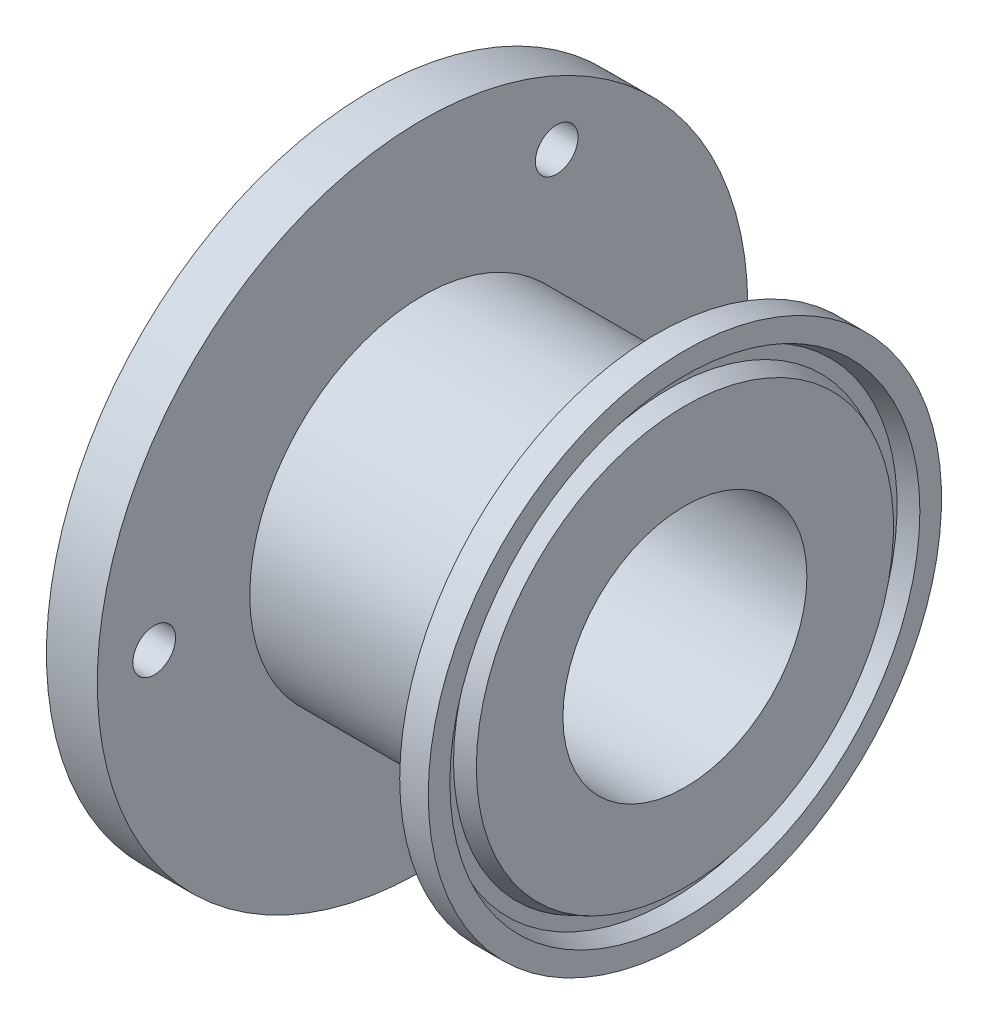
ISO-10303-21;
HEADER;
FILE_DESCRIPTION(('STEP AP214'),'2;1');
FILE_NAME('part.step','',(''),(''),'','','');
FILE_SCHEMA(('AUTOMOTIVE_DESIGN { 1 0 10303 214 1 1 1 1 }'));
ENDSEC;
DATA;
#1=APPLICATION_CONTEXT('core data for automotive mechanical design processes');
#2=APPLICATION_PROTOCOL_DEFINITION('international standard','automotive_design',2000,#1);
#3=PRODUCT_CONTEXT('',#1,'mechanical');
#4=PRODUCT('Part','Part','',(#3));
#5=PRODUCT_RELATED_PRODUCT_CATEGORY('part','',(#4));
#6=PRODUCT_DEFINITION_FORMATION('','',#4);
#7=PRODUCT_DEFINITION_CONTEXT('part definition',#1,'design');
#8=PRODUCT_DEFINITION('design','',#6,#7);
#9=PRODUCT_DEFINITION_SHAPE('','',#8);
#10=(LENGTH_UNIT() NAMED_UNIT(*) SI_UNIT(.MILLI.,.METRE.));
#11=(NAMED_UNIT(*) PLANE_ANGLE_UNIT() SI_UNIT($,.RADIAN.));
#12=(NAMED_UNIT(*) SI_UNIT($,.STERADIAN.) SOLID_ANGLE_UNIT());
#13=UNCERTAINTY_MEASURE_WITH_UNIT(LENGTH_MEASURE(1.E-05),#10,'distance_accuracy_value','');
#14=(GEOMETRIC_REPRESENTATION_CONTEXT(3) GLOBAL_UNCERTAINTY_ASSIGNED_CONTEXT((#13)) GLOBAL_UNIT_ASSIGNED_CONTEXT((#10,
#11,#12)) REPRESENTATION_CONTEXT('',''));
#15=CARTESIAN_POINT('',(0.,0.,0.));
#16=DIRECTION('',(0.,0.,1.));
#17=DIRECTION('',(1.,0.,0.));
#18=AXIS2_PLACEMENT_3D('',#15,#16,#17);
#19=CARTESIAN_POINT('',(-10.4047272163481,34.,0.));
#20=DIRECTION('',(-1.,0.,0.));
#21=DIRECTION('',(0.,0.,1.));
#22=AXIS2_PLACEMENT_3D('',#19,#20,#21);
#23=PLANE('',#22);
#24=CARTESIAN_POINT('',(-10.4047272163481,0.,0.));
#25=DIRECTION('',(-1.,0.,0.));
#26=DIRECTION('',(0.,0.,1.));
#27=AXIS2_PLACEMENT_3D('',#24,#25,#26);
#28=CIRCLE('',#27,17.);
#29=CARTESIAN_POINT('',(-10.4047272163481,0.,17.));
#30=VERTEX_POINT('',#29);
#31=EDGE_CURVE('E81',#30,#30,#28,.T.);
#32=ORIENTED_EDGE('',*,*,#31,.T.);
#33=EDGE_LOOP('',(#32));
#34=FACE_BOUND('',#33,.T.);
#35=CARTESIAN_POINT('',(-10.4047272163481,1.08713038571295E-09,26.4000000000021));
#36=DIRECTION('',(-1.,0.,0.));
#37=DIRECTION('',(0.,0.,1.));
#38=AXIS2_PLACEMENT_3D('',#35,#36,#37);
#39=CIRCLE('',#38,2.1);
#40=CARTESIAN_POINT('',(-10.4047272163481,1.08713038571295E-09,28.5000000000021));
#41=VERTEX_POINT('',#40);
#42=EDGE_CURVE('E87',#41,#41,#39,.T.);
#43=ORIENTED_EDGE('',*,*,#42,.T.);
#44=EDGE_LOOP('',(#43));
#45=FACE_BOUND('',#44,.T.);
#46=CARTESIAN_POINT('',(-10.4047272163481,22.8630706593604,-13.2000000009425));
#47=DIRECTION('',(-1.,0.,0.));
#48=DIRECTION('',(0.,0.,1.));
#49=AXIS2_PLACEMENT_3D('',#46,#47,#48);
#50=CIRCLE('',#49,2.1);
#51=CARTESIAN_POINT('',(-10.4047272163481,22.8630706593604,-11.1000000009425));
#52=VERTEX_POINT('',#51);
#53=EDGE_CURVE('E93',#52,#52,#50,.T.);
#54=ORIENTED_EDGE('',*,*,#53,.T.);
#55=EDGE_LOOP('',(#54));
#56=FACE_BOUND('',#55,.T.);
#57=CARTESIAN_POINT('',(-10.4047272163481,-22.8630706604579,-13.1999999990536));
#58=DIRECTION('',(-1.,0.,0.));
#59=DIRECTION('',(0.,0.,1.));
#60=AXIS2_PLACEMENT_3D('',#57,#58,#59);
#61=CIRCLE('',#60,2.1);
#62=CARTESIAN_POINT('',(-10.4047272163481,-22.8630706604579,-11.0999999990536));
#63=VERTEX_POINT('',#62);
#64=EDGE_CURVE('E99',#63,#63,#61,.T.);
#65=ORIENTED_EDGE('',*,*,#64,.T.);
#66=EDGE_LOOP('',(#65));
#67=FACE_BOUND('',#66,.T.);
#68=CARTESIAN_POINT('',(-10.4047272163481,0.,0.));
#69=DIRECTION('',(1.,0.,0.));
#70=DIRECTION('',(0.,0.,-1.));
#71=AXIS2_PLACEMENT_3D('',#68,#69,#70);
#72=CIRCLE('',#71,32.);
#73=CARTESIAN_POINT('',(-10.4047272163481,0.,-32.));
#74=VERTEX_POINT('',#73);
#75=EDGE_CURVE('E106',#74,#74,#72,.T.);
#76=ORIENTED_EDGE('',*,*,#75,.T.);
#77=EDGE_LOOP('',(#76));
#78=FACE_BOUND('',#77,.T.);
#79=ADVANCED_FACE('F46',(#34,#45,#56,#67,#78),#23,.F.);
#80=CARTESIAN_POINT('',(-15.4047272163481,12.,0.));
#81=DIRECTION('',(1.,0.,0.));
#82=DIRECTION('',(0.,0.,-1.));
#83=AXIS2_PLACEMENT_3D('',#80,#81,#82);
#84=PLANE('',#83);
#85=CARTESIAN_POINT('',(-15.4047272163481,0.,0.));
#86=DIRECTION('',(-1.,0.,0.));
#87=DIRECTION('',(0.,0.,1.));
#88=AXIS2_PLACEMENT_3D('',#85,#86,#87);
#89=CIRCLE('',#88,12.);
#90=CARTESIAN_POINT('',(-15.4047272163481,0.,12.));
#91=VERTEX_POINT('',#90);
#92=EDGE_CURVE('E84',#91,#91,#89,.T.);
#93=ORIENTED_EDGE('',*,*,#92,.F.);
#94=EDGE_LOOP('',(#93));
#95=FACE_BOUND('',#94,.T.);
#96=CARTESIAN_POINT('',(-15.4047272163481,1.08713038571295E-09,26.4000000000021));
#97=DIRECTION('',(-1.,0.,0.));
#98=DIRECTION('',(0.,0.,1.));
#99=AXIS2_PLACEMENT_3D('',#96,#97,#98);
#100=CIRCLE('',#99,2.1);
#101=CARTESIAN_POINT('',(-15.4047272163481,1.08713038571295E-09,28.5000000000021));
#102=VERTEX_POINT('',#101);
#103=EDGE_CURVE('E90',#102,#102,#100,.T.);
#104=ORIENTED_EDGE('',*,*,#103,.F.);
#105=EDGE_LOOP('',(#104));
#106=FACE_BOUND('',#105,.T.);
#107=CARTESIAN_POINT('',(-15.4047272163481,22.8630706593604,-13.2000000009425));
#108=DIRECTION('',(-1.,0.,0.));
#109=DIRECTION('',(0.,0.,1.));
#110=AXIS2_PLACEMENT_3D('',#107,#108,#109);
#111=CIRCLE('',#110,2.1);
#112=CARTESIAN_POINT('',(-15.4047272163481,22.8630706593604,-11.1000000009425));
#113=VERTEX_POINT('',#112);
#114=EDGE_CURVE('E96',#113,#113,#111,.T.);
#115=ORIENTED_EDGE('',*,*,#114,.F.);
#116=EDGE_LOOP('',(#115));
#117=FACE_BOUND('',#116,.T.);
#118=CARTESIAN_POINT('',(-15.4047272163481,-22.8630706604579,-13.1999999990536));
#119=DIRECTION('',(-1.,0.,0.));
#120=DIRECTION('',(0.,0.,1.));
#121=AXIS2_PLACEMENT_3D('',#118,#119,#120);
#122=CIRCLE('',#121,2.1);
#123=CARTESIAN_POINT('',(-15.4047272163481,-22.8630706604579,-11.0999999990536));
#124=VERTEX_POINT('',#123);
#125=EDGE_CURVE('E102',#124,#124,#122,.T.);
#126=ORIENTED_EDGE('',*,*,#125,.F.);
#127=EDGE_LOOP('',(#126));
#128=FACE_BOUND('',#127,.T.);
#129=CARTESIAN_POINT('',(-15.4047272163481,0.,0.));
#130=DIRECTION('',(1.,0.,0.));
#131=DIRECTION('',(0.,0.,-1.));
#132=AXIS2_PLACEMENT_3D('',#129,#130,#131);
#133=CIRCLE('',#132,32.);
#134=CARTESIAN_POINT('',(-15.4047272163481,0.,-32.));
#135=VERTEX_POINT('',#134);
#136=EDGE_CURVE('E105',#135,#135,#133,.T.);
#137=ORIENTED_EDGE('',*,*,#136,.F.);
#138=EDGE_LOOP('',(#137));
#139=FACE_BOUND('',#138,.T.);
#140=ADVANCED_FACE('F115',(#95,#106,#117,#128,#139),#84,.F.);
#141=CARTESIAN_POINT('',(0.,0.,0.));
#142=DIRECTION('',(-1.,0.,0.));
#143=DIRECTION('',(0.,0.,1.));
#144=AXIS2_PLACEMENT_3D('',#141,#142,#143);
#145=CYLINDRICAL_SURFACE('',#144,12.);
#146=CARTESIAN_POINT('',(15.4047272163481,0.,0.));
#147=DIRECTION('',(-1.,0.,0.));
#148=DIRECTION('',(0.,0.,1.));
#149=AXIS2_PLACEMENT_3D('',#146,#147,#148);
#150=CIRCLE('',#149,12.);
#151=CARTESIAN_POINT('',(15.4047272163481,0.,12.));
#152=VERTEX_POINT('',#151);
#153=EDGE_CURVE('E11',#152,#152,#150,.T.);
#154=ORIENTED_EDGE('',*,*,#153,.F.);
#155=EDGE_LOOP('',(#154));
#156=FACE_BOUND('',#155,.T.);
#157=ORIENTED_EDGE('',*,*,#92,.T.);
#158=EDGE_LOOP('',(#157));
#159=FACE_BOUND('',#158,.T.);
#160=ADVANCED_FACE('F48',(#156,#159),#145,.F.);
#161=CARTESIAN_POINT('',(15.4047272163481,20.5186,0.));
#162=DIRECTION('',(-1.,0.,0.));
#163=DIRECTION('',(0.,0.,1.));
#164=AXIS2_PLACEMENT_3D('',#161,#162,#163);
#165=PLANE('',#164);
#166=CARTESIAN_POINT('',(15.4047272163481,0.,0.));
#167=DIRECTION('',(-1.,0.,0.));
#168=DIRECTION('',(0.,0.,1.));
#169=AXIS2_PLACEMENT_3D('',#166,#167,#168);
#170=CIRCLE('',#169,20.5186);
#171=CARTESIAN_POINT('',(15.4047272163481,0.,20.5186));
#172=VERTEX_POINT('',#171);
#173=EDGE_CURVE('E53',#172,#172,#170,.T.);
#174=ORIENTED_EDGE('',*,*,#173,.F.);
#175=EDGE_LOOP('',(#174));
#176=FACE_BOUND('',#175,.T.);
#177=ORIENTED_EDGE('',*,*,#153,.T.);
#178=EDGE_LOOP('',(#177));
#179=FACE_BOUND('',#178,.T.);
#180=ADVANCED_FACE('F123',(#176,#179),#165,.F.);
#181=CARTESIAN_POINT('',(15.4047272163481,0.,0.));
#182=DIRECTION('',(-1.,0.,0.));
#183=DIRECTION('',(0.,0.,1.));
#184=AXIS2_PLACEMENT_3D('',#181,#182,#183);
#185=CONICAL_SURFACE('',#184,20.5186,0.401425727958695);
#186=CARTESIAN_POINT('',(13.8299272163481,0.,0.));
#187=DIRECTION('',(-1.,0.,0.));
#188=DIRECTION('',(0.,0.,1.));
#189=AXIS2_PLACEMENT_3D('',#186,#187,#188);
#190=CIRCLE('',#189,21.1870629405669);
#191=CARTESIAN_POINT('',(13.8299272163481,0.,21.1870629405669));
#192=VERTEX_POINT('',#191);
#193=EDGE_CURVE('E57',#192,#192,#190,.T.);
#194=ORIENTED_EDGE('',*,*,#193,.F.);
#195=EDGE_LOOP('',(#194));
#196=FACE_BOUND('',#195,.T.);
#197=ORIENTED_EDGE('',*,*,#173,.T.);
#198=EDGE_LOOP('',(#197));
#199=FACE_BOUND('',#198,.T.);
#200=ADVANCED_FACE('F160',(#196,#199),#185,.T.);
#201=CARTESIAN_POINT('',(13.8299272163481,22.4501370594331,0.));
#202=DIRECTION('',(-1.,0.,0.));
#203=DIRECTION('',(0.,0.,1.));
#204=AXIS2_PLACEMENT_3D('',#201,#202,#203);
#205=PLANE('',#204);
#206=CARTESIAN_POINT('',(13.8299272163481,0.,0.));
#207=DIRECTION('',(-1.,0.,0.));
#208=DIRECTION('',(0.,0.,1.));
#209=AXIS2_PLACEMENT_3D('',#206,#207,#208);
#210=CIRCLE('',#209,22.4501370594331);
#211=CARTESIAN_POINT('',(13.8299272163481,0.,22.4501370594331));
#212=VERTEX_POINT('',#211);
#213=EDGE_CURVE('E61',#212,#212,#210,.T.);
#214=ORIENTED_EDGE('',*,*,#213,.F.);
#215=EDGE_LOOP('',(#214));
#216=FACE_BOUND('',#215,.T.);
#217=ORIENTED_EDGE('',*,*,#193,.T.);
#218=EDGE_LOOP('',(#217));
#219=FACE_BOUND('',#218,.T.);
#220=ADVANCED_FACE('F156',(#216,#219),#205,.F.);
#221=CARTESIAN_POINT('',(13.8299272163481,0.,0.));
#222=DIRECTION('',(1.,0.,0.));
#223=DIRECTION('',(0.,0.,-1.));
#224=AXIS2_PLACEMENT_3D('',#221,#222,#223);
#225=CONICAL_SURFACE('',#224,22.4501370594331,0.401425727958695);
#226=CARTESIAN_POINT('',(15.4047272163481,0.,0.));
#227=DIRECTION('',(-1.,0.,0.));
#228=DIRECTION('',(0.,0.,1.));
#229=AXIS2_PLACEMENT_3D('',#226,#227,#228);
#230=CIRCLE('',#229,23.1186);
#231=CARTESIAN_POINT('',(15.4047272163481,0.,23.1186));
#232=VERTEX_POINT('',#231);
#233=EDGE_CURVE('E66',#232,#232,#230,.T.);
#234=ORIENTED_EDGE('',*,*,#233,.F.);
#235=EDGE_LOOP('',(#234));
#236=FACE_BOUND('',#235,.T.);
#237=ORIENTED_EDGE('',*,*,#213,.T.);
#238=EDGE_LOOP('',(#237));
#239=FACE_BOUND('',#238,.T.);
#240=ADVANCED_FACE('F152',(#236,#239),#225,.F.);
#241=CARTESIAN_POINT('',(15.4047272163481,25.25,0.));
#242=DIRECTION('',(-1.,0.,0.));
#243=DIRECTION('',(0.,0.,1.));
#244=AXIS2_PLACEMENT_3D('',#241,#242,#243);
#245=PLANE('',#244);
#246=CARTESIAN_POINT('',(15.4047272163481,0.,0.));
#247=DIRECTION('',(-1.,0.,0.));
#248=DIRECTION('',(0.,0.,1.));
#249=AXIS2_PLACEMENT_3D('',#246,#247,#248);
#250=CIRCLE('',#249,25.25);
#251=CARTESIAN_POINT('',(15.4047272163481,0.,25.25));
#252=VERTEX_POINT('',#251);
#253=EDGE_CURVE('E69',#252,#252,#250,.T.);
#254=ORIENTED_EDGE('',*,*,#253,.F.);
#255=EDGE_LOOP('',(#254));
#256=FACE_BOUND('',#255,.T.);
#257=ORIENTED_EDGE('',*,*,#233,.T.);
#258=EDGE_LOOP('',(#257));
#259=FACE_BOUND('',#258,.T.);
#260=ADVANCED_FACE('F148',(#256,#259),#245,.F.);
#261=CARTESIAN_POINT('',(0.,0.,0.));
#262=DIRECTION('',(-1.,0.,0.));
#263=DIRECTION('',(0.,0.,1.));
#264=AXIS2_PLACEMENT_3D('',#261,#262,#263);
#265=CYLINDRICAL_SURFACE('',#264,25.25);
#266=CARTESIAN_POINT('',(12.5980272163481,0.,0.));
#267=DIRECTION('',(-1.,0.,0.));
#268=DIRECTION('',(0.,0.,1.));
#269=AXIS2_PLACEMENT_3D('',#266,#267,#268);
#270=CIRCLE('',#269,25.25);
#271=CARTESIAN_POINT('',(12.5980272163481,0.,25.25));
#272=VERTEX_POINT('',#271);
#273=EDGE_CURVE('E72',#272,#272,#270,.T.);
#274=ORIENTED_EDGE('',*,*,#273,.F.);
#275=EDGE_LOOP('',(#274));
#276=FACE_BOUND('',#275,.T.);
#277=ORIENTED_EDGE('',*,*,#253,.T.);
#278=EDGE_LOOP('',(#277));
#279=FACE_BOUND('',#278,.T.);
#280=ADVANCED_FACE('F144',(#276,#279),#265,.T.);
#281=CARTESIAN_POINT('',(12.5980272163481,0.,0.));
#282=DIRECTION('',(1.,0.,0.));
#283=DIRECTION('',(0.,0.,-1.));
#284=AXIS2_PLACEMENT_3D('',#281,#282,#283);
#285=CONICAL_SURFACE('',#284,25.25,1.22173047639604);
#286=CARTESIAN_POINT('',(9.86900423303653,0.,0.));
#287=DIRECTION('',(-1.,0.,0.));
#288=DIRECTION('',(0.,0.,1.));
#289=AXIS2_PLACEMENT_3D('',#286,#287,#288);
#290=CIRCLE('',#289,17.7520709761788);
#291=CARTESIAN_POINT('',(9.86900423303653,0.,17.7520709761788));
#292=VERTEX_POINT('',#291);
#293=EDGE_CURVE('E75',#292,#292,#290,.T.);
#294=ORIENTED_EDGE('',*,*,#293,.F.);
#295=EDGE_LOOP('',(#294));
#296=FACE_BOUND('',#295,.T.);
#297=ORIENTED_EDGE('',*,*,#273,.T.);
#298=EDGE_LOOP('',(#297));
#299=FACE_BOUND('',#298,.T.);
#300=ADVANCED_FACE('F140',(#296,#299),#285,.T.);
#301=CARTESIAN_POINT('',(8.79493556747824,0.,0.));
#302=DIRECTION('',(-1.,0.,0.));
#303=DIRECTION('',(0.,0.,1.));
#304=AXIS2_PLACEMENT_3D('',#301,#302,#303);
#305=TOROIDAL_SURFACE('',#304,18.143,1.143);
#306=CARTESIAN_POINT('',(8.79493556747824,0.,0.));
#307=DIRECTION('',(-1.,0.,0.));
#308=DIRECTION('',(0.,0.,1.));
#309=AXIS2_PLACEMENT_3D('',#306,#307,#308);
#310=CIRCLE('',#309,17.);
#311=CARTESIAN_POINT('',(8.79493556747824,0.,17.));
#312=VERTEX_POINT('',#311);
#313=EDGE_CURVE('E78',#312,#312,#310,.T.);
#314=ORIENTED_EDGE('',*,*,#313,.F.);
#315=EDGE_LOOP('',(#314));
#316=FACE_BOUND('',#315,.T.);
#317=ORIENTED_EDGE('',*,*,#293,.T.);
#318=EDGE_LOOP('',(#317));
#319=FACE_BOUND('',#318,.T.);
#320=ADVANCED_FACE('F136',(#316,#319),#305,.F.);
#321=CARTESIAN_POINT('',(0.,0.,0.));
#322=DIRECTION('',(-1.,0.,0.));
#323=DIRECTION('',(0.,0.,1.));
#324=AXIS2_PLACEMENT_3D('',#321,#322,#323);
#325=CYLINDRICAL_SURFACE('',#324,17.);
#326=ORIENTED_EDGE('',*,*,#31,.F.);
#327=EDGE_LOOP('',(#326));
#328=FACE_BOUND('',#327,.T.);
#329=ORIENTED_EDGE('',*,*,#313,.T.);
#330=EDGE_LOOP('',(#329));
#331=FACE_BOUND('',#330,.T.);
#332=ADVANCED_FACE('F133',(#328,#331),#325,.T.);
#333=CARTESIAN_POINT('',(-15.4047272163481,1.08713038571295E-09,26.4000000000021));
#334=DIRECTION('',(-1.,0.,0.));
#335=DIRECTION('',(0.,0.,1.));
#336=AXIS2_PLACEMENT_3D('',#333,#334,#335);
#337=CYLINDRICAL_SURFACE('',#336,2.1);
#338=ORIENTED_EDGE('',*,*,#103,.T.);
#339=EDGE_LOOP('',(#338));
#340=FACE_BOUND('',#339,.T.);
#341=ORIENTED_EDGE('',*,*,#42,.F.);
#342=EDGE_LOOP('',(#341));
#343=FACE_BOUND('',#342,.T.);
#344=ADVANCED_FACE('F130',(#340,#343),#337,.F.);
#345=CARTESIAN_POINT('',(-15.4047272163481,22.8630706593604,-13.2000000009425));
#346=DIRECTION('',(-1.,0.,0.));
#347=DIRECTION('',(0.,0.,1.));
#348=AXIS2_PLACEMENT_3D('',#345,#346,#347);
#349=CYLINDRICAL_SURFACE('',#348,2.1);
#350=ORIENTED_EDGE('',*,*,#114,.T.);
#351=EDGE_LOOP('',(#350));
#352=FACE_BOUND('',#351,.T.);
#353=ORIENTED_EDGE('',*,*,#53,.F.);
#354=EDGE_LOOP('',(#353));
#355=FACE_BOUND('',#354,.T.);
#356=ADVANCED_FACE('F208',(#352,#355),#349,.F.);
#357=CARTESIAN_POINT('',(-15.4047272163481,-22.8630706604579,-13.1999999990536));
#358=DIRECTION('',(-1.,0.,0.));
#359=DIRECTION('',(0.,0.,1.));
#360=AXIS2_PLACEMENT_3D('',#357,#358,#359);
#361=CYLINDRICAL_SURFACE('',#360,2.1);
#362=ORIENTED_EDGE('',*,*,#125,.T.);
#363=EDGE_LOOP('',(#362));
#364=FACE_BOUND('',#363,.T.);
#365=ORIENTED_EDGE('',*,*,#64,.F.);
#366=EDGE_LOOP('',(#365));
#367=FACE_BOUND('',#366,.T.);
#368=ADVANCED_FACE('F215',(#364,#367),#361,.F.);
#369=CARTESIAN_POINT('',(-15.4047272163481,0.,0.));
#370=DIRECTION('',(1.,0.,0.));
#371=DIRECTION('',(0.,0.,-1.));
#372=AXIS2_PLACEMENT_3D('',#369,#370,#371);
#373=CYLINDRICAL_SURFACE('',#372,32.);
#374=ORIENTED_EDGE('',*,*,#136,.T.);
#375=EDGE_LOOP('',(#374));
#376=FACE_BOUND('',#375,.T.);
#377=ORIENTED_EDGE('',*,*,#75,.F.);
#378=EDGE_LOOP('',(#377));
#379=FACE_BOUND('',#378,.T.);
#380=ADVANCED_FACE('F112',(#376,#379),#373,.T.);
#381=CLOSED_SHELL('',(#79,#140,#160,#180,#200,#220,#240,#260,#280,#300,#320,#332,#344,#356,#368,#380));
#382=MANIFOLD_SOLID_BREP('B2',#381);
#383=ADVANCED_BREP_SHAPE_REPRESENTATION('',(#18,#382),#14);
#384=SHAPE_DEFINITION_REPRESENTATION(#9,#383);
ENDSEC;
END-ISO-10303-21;
